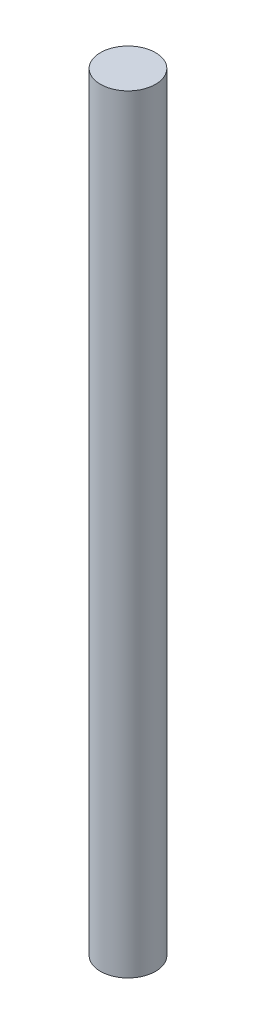
ISO-10303-21;
HEADER;
FILE_DESCRIPTION(('STEP AP214'),'2;1');
FILE_NAME('part.step','',(''),(''),'','','');
FILE_SCHEMA(('AUTOMOTIVE_DESIGN { 1 0 10303 214 1 1 1 1 }'));
ENDSEC;
DATA;
#1=APPLICATION_CONTEXT('core data for automotive mechanical design processes');
#2=APPLICATION_PROTOCOL_DEFINITION('international standard','automotive_design',2000,#1);
#3=PRODUCT_CONTEXT('',#1,'mechanical');
#4=PRODUCT('Part','Part','',(#3));
#5=PRODUCT_RELATED_PRODUCT_CATEGORY('part','',(#4));
#6=PRODUCT_DEFINITION_FORMATION('','',#4);
#7=PRODUCT_DEFINITION_CONTEXT('part definition',#1,'design');
#8=PRODUCT_DEFINITION('design','',#6,#7);
#9=PRODUCT_DEFINITION_SHAPE('','',#8);
#10=(LENGTH_UNIT() NAMED_UNIT(*) SI_UNIT(.MILLI.,.METRE.));
#11=(NAMED_UNIT(*) PLANE_ANGLE_UNIT() SI_UNIT($,.RADIAN.));
#12=(NAMED_UNIT(*) SI_UNIT($,.STERADIAN.) SOLID_ANGLE_UNIT());
#13=UNCERTAINTY_MEASURE_WITH_UNIT(LENGTH_MEASURE(1.E-05),#10,'distance_accuracy_value','');
#14=(GEOMETRIC_REPRESENTATION_CONTEXT(3) GLOBAL_UNCERTAINTY_ASSIGNED_CONTEXT((#13)) GLOBAL_UNIT_ASSIGNED_CONTEXT((#10,
#11,#12)) REPRESENTATION_CONTEXT('',''));
#15=CARTESIAN_POINT('',(0.,0.,0.));
#16=DIRECTION('',(0.,0.,1.));
#17=DIRECTION('',(1.,0.,0.));
#18=AXIS2_PLACEMENT_3D('',#15,#16,#17);
#19=CARTESIAN_POINT('',(0.,69.85,0.));
#20=DIRECTION('',(0.,-1.,0.));
#21=DIRECTION('',(0.,0.,-1.));
#22=AXIS2_PLACEMENT_3D('',#19,#20,#21);
#23=CYLINDRICAL_SURFACE('',#22,2.5);
#24=CARTESIAN_POINT('',(0.,69.85,0.));
#25=DIRECTION('',(0.,1.,0.));
#26=DIRECTION('',(0.,0.,1.));
#27=AXIS2_PLACEMENT_3D('',#24,#25,#26);
#28=CIRCLE('',#27,2.5);
#29=CARTESIAN_POINT('',(0.,69.85,2.5));
#30=VERTEX_POINT('',#29);
#31=EDGE_CURVE('E10',#30,#30,#28,.T.);
#32=ORIENTED_EDGE('',*,*,#31,.F.);
#33=EDGE_LOOP('',(#32));
#34=FACE_BOUND('',#33,.T.);
#35=CARTESIAN_POINT('',(0.,0.,0.));
#36=DIRECTION('',(0.,1.,0.));
#37=DIRECTION('',(0.,0.,1.));
#38=AXIS2_PLACEMENT_3D('',#35,#36,#37);
#39=CIRCLE('',#38,2.5);
#40=CARTESIAN_POINT('',(0.,0.,2.5));
#41=VERTEX_POINT('',#40);
#42=EDGE_CURVE('E44',#41,#41,#39,.T.);
#43=ORIENTED_EDGE('',*,*,#42,.T.);
#44=EDGE_LOOP('',(#43));
#45=FACE_BOUND('',#44,.T.);
#46=ADVANCED_FACE('F41',(#34,#45),#23,.T.);
#47=CARTESIAN_POINT('',(0.,69.85,0.));
#48=DIRECTION('',(0.,1.,0.));
#49=DIRECTION('',(0.,0.,1.));
#50=AXIS2_PLACEMENT_3D('',#47,#48,#49);
#51=PLANE('',#50);
#52=ORIENTED_EDGE('',*,*,#31,.T.);
#53=EDGE_LOOP('',(#52));
#54=FACE_BOUND('',#53,.T.);
#55=ADVANCED_FACE('F58',(#54),#51,.T.);
#56=CARTESIAN_POINT('',(0.,0.,0.));
#57=DIRECTION('',(0.,1.,0.));
#58=DIRECTION('',(0.,0.,1.));
#59=AXIS2_PLACEMENT_3D('',#56,#57,#58);
#60=PLANE('',#59);
#61=ORIENTED_EDGE('',*,*,#42,.F.);
#62=EDGE_LOOP('',(#61));
#63=FACE_BOUND('',#62,.T.);
#64=ADVANCED_FACE('F56',(#63),#60,.F.);
#65=CLOSED_SHELL('',(#46,#55,#64));
#66=MANIFOLD_SOLID_BREP('B2',#65);
#67=ADVANCED_BREP_SHAPE_REPRESENTATION('',(#18,#66),#14);
#68=SHAPE_DEFINITION_REPRESENTATION(#9,#67);
ENDSEC;
END-ISO-10303-21;
